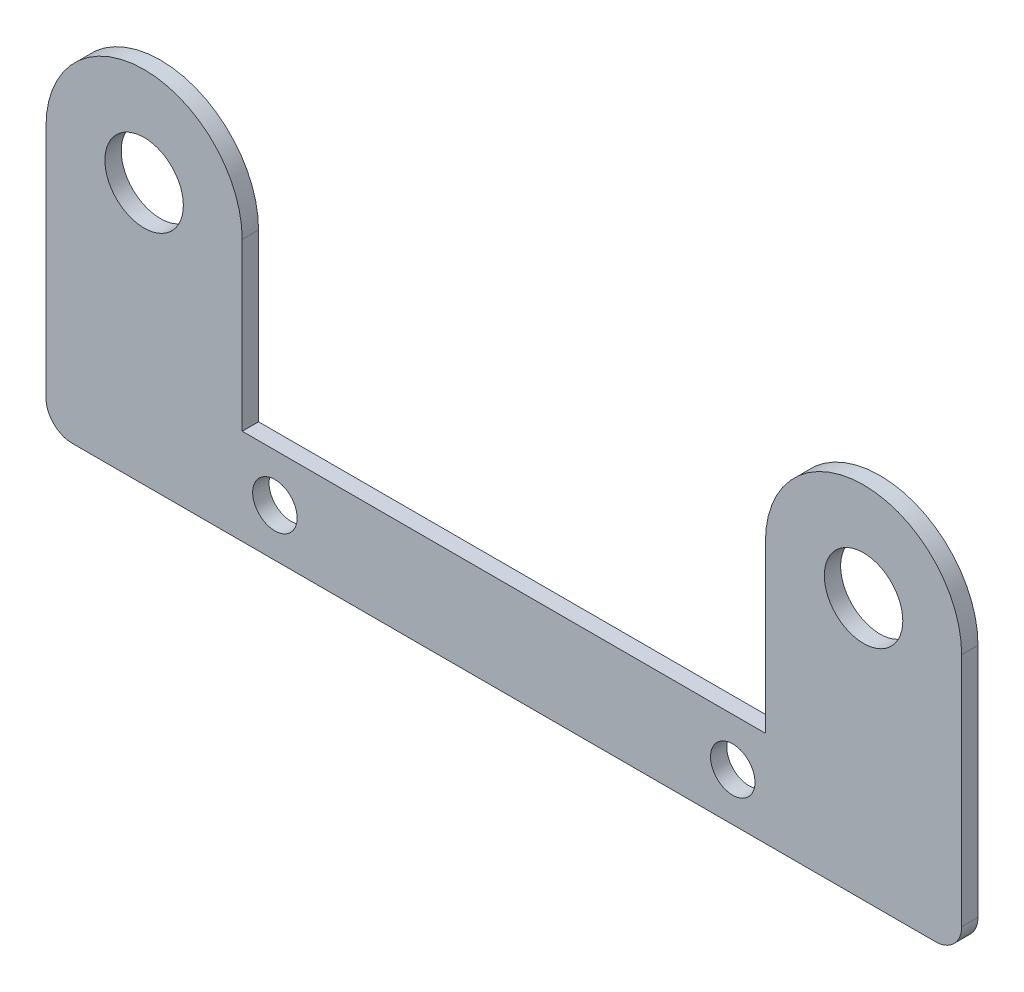
ISO-10303-21;
HEADER;
FILE_DESCRIPTION(('STEP AP214'),'2;1');
FILE_NAME('part.step','',(''),(''),'','','');
FILE_SCHEMA(('AUTOMOTIVE_DESIGN { 1 0 10303 214 1 1 1 1 }'));
ENDSEC;
DATA;
#1=APPLICATION_CONTEXT('core data for automotive mechanical design processes');
#2=APPLICATION_PROTOCOL_DEFINITION('international standard','automotive_design',2000,#1);
#3=PRODUCT_CONTEXT('',#1,'mechanical');
#4=PRODUCT('Part','Part','',(#3));
#5=PRODUCT_RELATED_PRODUCT_CATEGORY('part','',(#4));
#6=PRODUCT_DEFINITION_FORMATION('','',#4);
#7=PRODUCT_DEFINITION_CONTEXT('part definition',#1,'design');
#8=PRODUCT_DEFINITION('design','',#6,#7);
#9=PRODUCT_DEFINITION_SHAPE('','',#8);
#10=(LENGTH_UNIT() NAMED_UNIT(*) SI_UNIT(.MILLI.,.METRE.));
#11=(NAMED_UNIT(*) PLANE_ANGLE_UNIT() SI_UNIT($,.RADIAN.));
#12=(NAMED_UNIT(*) SI_UNIT($,.STERADIAN.) SOLID_ANGLE_UNIT());
#13=UNCERTAINTY_MEASURE_WITH_UNIT(LENGTH_MEASURE(1.E-05),#10,'distance_accuracy_value','');
#14=(GEOMETRIC_REPRESENTATION_CONTEXT(3) GLOBAL_UNCERTAINTY_ASSIGNED_CONTEXT((#13)) GLOBAL_UNIT_ASSIGNED_CONTEXT((#10,
#11,#12)) REPRESENTATION_CONTEXT('',''));
#15=CARTESIAN_POINT('',(0.,0.,0.));
#16=DIRECTION('',(0.,0.,1.));
#17=DIRECTION('',(1.,0.,0.));
#18=AXIS2_PLACEMENT_3D('',#15,#16,#17);
#19=CARTESIAN_POINT('',(9.525,25.4,1.5875));
#20=DIRECTION('',(0.,0.,-1.));
#21=DIRECTION('',(-1.,0.,0.));
#22=AXIS2_PLACEMENT_3D('',#19,#20,#21);
#23=PLANE('',#22);
#24=DIRECTION('',(1.,0.,0.));
#25=VECTOR('',#24,1.);
#26=CARTESIAN_POINT('',(0.,0.,1.5875));
#27=LINE('',#26,#25);
#28=CARTESIAN_POINT('',(2.54,0.,1.5875));
#29=VERTEX_POINT('',#28);
#30=CARTESIAN_POINT('',(86.36,0.,1.5875));
#31=VERTEX_POINT('',#30);
#32=EDGE_CURVE('E153',#29,#31,#27,.T.);
#33=ORIENTED_EDGE('',*,*,#32,.T.);
#34=CARTESIAN_POINT('',(86.36,2.54000000000002,1.5875));
#35=DIRECTION('',(0.,0.,-1.));
#36=DIRECTION('',(-1.,0.,0.));
#37=AXIS2_PLACEMENT_3D('',#34,#35,#36);
#38=CIRCLE('',#37,2.54);
#39=CARTESIAN_POINT('',(88.9,2.54000000000002,1.5875));
#40=VERTEX_POINT('',#39);
#41=EDGE_CURVE('E41',#31,#40,#38,.F.);
#42=ORIENTED_EDGE('',*,*,#41,.T.);
#43=DIRECTION('',(0.,1.,0.));
#44=VECTOR('',#43,1.);
#45=CARTESIAN_POINT('',(88.9,25.4,1.5875));
#46=LINE('',#45,#44);
#47=CARTESIAN_POINT('',(88.9,25.4,1.5875));
#48=VERTEX_POINT('',#47);
#49=EDGE_CURVE('E111',#40,#48,#46,.T.);
#50=ORIENTED_EDGE('',*,*,#49,.T.);
#51=CARTESIAN_POINT('',(79.375,25.4,1.5875));
#52=DIRECTION('',(0.,0.,1.));
#53=DIRECTION('',(-1.,0.,0.));
#54=AXIS2_PLACEMENT_3D('',#51,#52,#53);
#55=CIRCLE('',#54,9.525);
#56=CARTESIAN_POINT('',(69.85,25.4,1.5875));
#57=VERTEX_POINT('',#56);
#58=EDGE_CURVE('E114',#48,#57,#55,.T.);
#59=ORIENTED_EDGE('',*,*,#58,.T.);
#60=DIRECTION('',(0.,-1.,0.));
#61=VECTOR('',#60,1.);
#62=CARTESIAN_POINT('',(69.85,9.27100000000001,1.5875));
#63=LINE('',#62,#61);
#64=CARTESIAN_POINT('',(69.85,9.27100000000001,1.5875));
#65=VERTEX_POINT('',#64);
#66=EDGE_CURVE('E130',#57,#65,#63,.T.);
#67=ORIENTED_EDGE('',*,*,#66,.T.);
#68=DIRECTION('',(-1.,0.,0.));
#69=VECTOR('',#68,1.);
#70=CARTESIAN_POINT('',(19.05,9.271,1.5875));
#71=LINE('',#70,#69);
#72=CARTESIAN_POINT('',(19.05,9.271,1.5875));
#73=VERTEX_POINT('',#72);
#74=EDGE_CURVE('E191',#65,#73,#71,.T.);
#75=ORIENTED_EDGE('',*,*,#74,.T.);
#76=DIRECTION('',(0.,1.,0.));
#77=VECTOR('',#76,1.);
#78=CARTESIAN_POINT('',(19.05,25.4,1.5875));
#79=LINE('',#78,#77);
#80=CARTESIAN_POINT('',(19.05,25.4,1.5875));
#81=VERTEX_POINT('',#80);
#82=EDGE_CURVE('E206',#73,#81,#79,.T.);
#83=ORIENTED_EDGE('',*,*,#82,.T.);
#84=CARTESIAN_POINT('',(9.525,25.4,1.5875));
#85=DIRECTION('',(0.,0.,1.));
#86=DIRECTION('',(-1.,0.,0.));
#87=AXIS2_PLACEMENT_3D('',#84,#85,#86);
#88=CIRCLE('',#87,9.525);
#89=CARTESIAN_POINT('',(0.,25.4,1.5875));
#90=VERTEX_POINT('',#89);
#91=EDGE_CURVE('E204',#81,#90,#88,.T.);
#92=ORIENTED_EDGE('',*,*,#91,.T.);
#93=DIRECTION('',(0.,-1.,0.));
#94=VECTOR('',#93,1.);
#95=CARTESIAN_POINT('',(0.,25.4,1.5875));
#96=LINE('',#95,#94);
#97=CARTESIAN_POINT('',(0.,2.54,1.5875));
#98=VERTEX_POINT('',#97);
#99=EDGE_CURVE('E154',#90,#98,#96,.T.);
#100=ORIENTED_EDGE('',*,*,#99,.T.);
#101=CARTESIAN_POINT('',(2.54,2.54,1.5875));
#102=DIRECTION('',(0.,0.,-1.));
#103=DIRECTION('',(-1.,0.,0.));
#104=AXIS2_PLACEMENT_3D('',#101,#102,#103);
#105=CIRCLE('',#104,2.54);
#106=EDGE_CURVE('E151',#98,#29,#105,.F.);
#107=ORIENTED_EDGE('',*,*,#106,.T.);
#108=EDGE_LOOP('',(#33,#42,#50,#59,#67,#75,#83,#92,#100,#107));
#109=FACE_BOUND('',#108,.T.);
#110=CARTESIAN_POINT('',(22.225,4.63549999999998,1.5875));
#111=DIRECTION('',(0.,0.,1.));
#112=DIRECTION('',(1.,0.,0.));
#113=AXIS2_PLACEMENT_3D('',#110,#111,#112);
#114=CIRCLE('',#113,2.159);
#115=CARTESIAN_POINT('',(24.384,4.63549999999998,1.5875));
#116=VERTEX_POINT('',#115);
#117=EDGE_CURVE('E201',#116,#116,#114,.T.);
#118=ORIENTED_EDGE('',*,*,#117,.F.);
#119=EDGE_LOOP('',(#118));
#120=FACE_BOUND('',#119,.T.);
#121=CARTESIAN_POINT('',(66.675,4.63550000000002,1.5875));
#122=DIRECTION('',(0.,0.,1.));
#123=DIRECTION('',(1.,0.,0.));
#124=AXIS2_PLACEMENT_3D('',#121,#122,#123);
#125=CIRCLE('',#124,2.15899999999998);
#126=CARTESIAN_POINT('',(68.834,4.63550000000002,1.5875));
#127=VERTEX_POINT('',#126);
#128=EDGE_CURVE('E213',#127,#127,#125,.T.);
#129=ORIENTED_EDGE('',*,*,#128,.F.);
#130=EDGE_LOOP('',(#129));
#131=FACE_BOUND('',#130,.T.);
#132=CARTESIAN_POINT('',(9.525,25.4,1.5875));
#133=DIRECTION('',(0.,0.,1.));
#134=DIRECTION('',(1.,0.,0.));
#135=AXIS2_PLACEMENT_3D('',#132,#133,#134);
#136=CIRCLE('',#135,3.81);
#137=CARTESIAN_POINT('',(13.335,25.4,1.5875));
#138=VERTEX_POINT('',#137);
#139=EDGE_CURVE('E219',#138,#138,#136,.T.);
#140=ORIENTED_EDGE('',*,*,#139,.F.);
#141=EDGE_LOOP('',(#140));
#142=FACE_BOUND('',#141,.T.);
#143=CARTESIAN_POINT('',(79.375,25.4,1.5875));
#144=DIRECTION('',(0.,0.,1.));
#145=DIRECTION('',(1.,0.,0.));
#146=AXIS2_PLACEMENT_3D('',#143,#144,#145);
#147=CIRCLE('',#146,3.81);
#148=CARTESIAN_POINT('',(83.185,25.4,1.5875));
#149=VERTEX_POINT('',#148);
#150=EDGE_CURVE('E225',#149,#149,#147,.T.);
#151=ORIENTED_EDGE('',*,*,#150,.F.);
#152=EDGE_LOOP('',(#151));
#153=FACE_BOUND('',#152,.T.);
#154=ADVANCED_FACE('F33',(#109,#120,#131,#142,#153),#23,.F.);
#155=CARTESIAN_POINT('',(9.525,25.4,0.));
#156=DIRECTION('',(0.,0.,-1.));
#157=DIRECTION('',(-1.,0.,0.));
#158=AXIS2_PLACEMENT_3D('',#155,#156,#157);
#159=PLANE('',#158);
#160=CARTESIAN_POINT('',(9.525,25.4,0.));
#161=DIRECTION('',(0.,0.,1.));
#162=DIRECTION('',(1.,0.,0.));
#163=AXIS2_PLACEMENT_3D('',#160,#161,#162);
#164=CIRCLE('',#163,3.81);
#165=CARTESIAN_POINT('',(13.335,25.4,0.));
#166=VERTEX_POINT('',#165);
#167=EDGE_CURVE('E222',#166,#166,#164,.T.);
#168=ORIENTED_EDGE('',*,*,#167,.T.);
#169=EDGE_LOOP('',(#168));
#170=FACE_BOUND('',#169,.T.);
#171=CARTESIAN_POINT('',(22.225,4.63549999999998,0.));
#172=DIRECTION('',(0.,0.,1.));
#173=DIRECTION('',(1.,0.,0.));
#174=AXIS2_PLACEMENT_3D('',#171,#172,#173);
#175=CIRCLE('',#174,2.159);
#176=CARTESIAN_POINT('',(24.384,4.63549999999998,0.));
#177=VERTEX_POINT('',#176);
#178=EDGE_CURVE('E210',#177,#177,#175,.T.);
#179=ORIENTED_EDGE('',*,*,#178,.T.);
#180=EDGE_LOOP('',(#179));
#181=FACE_BOUND('',#180,.T.);
#182=DIRECTION('',(0.,1.,0.));
#183=VECTOR('',#182,1.);
#184=CARTESIAN_POINT('',(88.9,25.4,0.));
#185=LINE('',#184,#183);
#186=CARTESIAN_POINT('',(88.9,2.54000000000002,0.));
#187=VERTEX_POINT('',#186);
#188=CARTESIAN_POINT('',(88.9,25.4,0.));
#189=VERTEX_POINT('',#188);
#190=EDGE_CURVE('E134',#187,#189,#185,.T.);
#191=ORIENTED_EDGE('',*,*,#190,.F.);
#192=CARTESIAN_POINT('',(86.36,2.54000000000002,0.));
#193=DIRECTION('',(0.,0.,-1.));
#194=DIRECTION('',(-1.,0.,0.));
#195=AXIS2_PLACEMENT_3D('',#192,#193,#194);
#196=CIRCLE('',#195,2.54);
#197=CARTESIAN_POINT('',(86.36,0.,0.));
#198=VERTEX_POINT('',#197);
#199=EDGE_CURVE('E145',#187,#198,#196,.T.);
#200=ORIENTED_EDGE('',*,*,#199,.T.);
#201=DIRECTION('',(1.,0.,0.));
#202=VECTOR('',#201,1.);
#203=CARTESIAN_POINT('',(0.,0.,0.));
#204=LINE('',#203,#202);
#205=CARTESIAN_POINT('',(2.54,0.,0.));
#206=VERTEX_POINT('',#205);
#207=EDGE_CURVE('E121',#206,#198,#204,.T.);
#208=ORIENTED_EDGE('',*,*,#207,.F.);
#209=CARTESIAN_POINT('',(2.54,2.54,0.));
#210=DIRECTION('',(0.,0.,-1.));
#211=DIRECTION('',(-1.,0.,0.));
#212=AXIS2_PLACEMENT_3D('',#209,#210,#211);
#213=CIRCLE('',#212,2.54);
#214=CARTESIAN_POINT('',(0.,2.54,0.));
#215=VERTEX_POINT('',#214);
#216=EDGE_CURVE('E138',#206,#215,#213,.T.);
#217=ORIENTED_EDGE('',*,*,#216,.T.);
#218=DIRECTION('',(0.,-1.,0.));
#219=VECTOR('',#218,1.);
#220=CARTESIAN_POINT('',(0.,25.4,0.));
#221=LINE('',#220,#219);
#222=CARTESIAN_POINT('',(0.,25.4,0.));
#223=VERTEX_POINT('',#222);
#224=EDGE_CURVE('E166',#223,#215,#221,.T.);
#225=ORIENTED_EDGE('',*,*,#224,.F.);
#226=CARTESIAN_POINT('',(9.525,25.4,0.));
#227=DIRECTION('',(0.,0.,1.));
#228=DIRECTION('',(-1.,0.,0.));
#229=AXIS2_PLACEMENT_3D('',#226,#227,#228);
#230=CIRCLE('',#229,9.525);
#231=CARTESIAN_POINT('',(19.05,25.4,0.));
#232=VERTEX_POINT('',#231);
#233=EDGE_CURVE('E170',#232,#223,#230,.T.);
#234=ORIENTED_EDGE('',*,*,#233,.F.);
#235=DIRECTION('',(0.,1.,0.));
#236=VECTOR('',#235,1.);
#237=CARTESIAN_POINT('',(19.05,25.4,0.));
#238=LINE('',#237,#236);
#239=CARTESIAN_POINT('',(19.05,9.271,0.));
#240=VERTEX_POINT('',#239);
#241=EDGE_CURVE('E173',#240,#232,#238,.T.);
#242=ORIENTED_EDGE('',*,*,#241,.F.);
#243=DIRECTION('',(-1.,0.,0.));
#244=VECTOR('',#243,1.);
#245=CARTESIAN_POINT('',(19.05,9.271,0.));
#246=LINE('',#245,#244);
#247=CARTESIAN_POINT('',(69.85,9.27100000000001,0.));
#248=VERTEX_POINT('',#247);
#249=EDGE_CURVE('E190',#248,#240,#246,.T.);
#250=ORIENTED_EDGE('',*,*,#249,.F.);
#251=DIRECTION('',(0.,-1.,0.));
#252=VECTOR('',#251,1.);
#253=CARTESIAN_POINT('',(69.85,9.27100000000001,0.));
#254=LINE('',#253,#252);
#255=CARTESIAN_POINT('',(69.85,25.4,0.));
#256=VERTEX_POINT('',#255);
#257=EDGE_CURVE('E195',#256,#248,#254,.T.);
#258=ORIENTED_EDGE('',*,*,#257,.F.);
#259=CARTESIAN_POINT('',(79.375,25.4,0.));
#260=DIRECTION('',(0.,0.,1.));
#261=DIRECTION('',(-1.,0.,0.));
#262=AXIS2_PLACEMENT_3D('',#259,#260,#261);
#263=CIRCLE('',#262,9.525);
#264=EDGE_CURVE('E197',#189,#256,#263,.T.);
#265=ORIENTED_EDGE('',*,*,#264,.F.);
#266=EDGE_LOOP('',(#191,#200,#208,#217,#225,#234,#242,#250,#258,#265));
#267=FACE_BOUND('',#266,.T.);
#268=CARTESIAN_POINT('',(66.675,4.63550000000002,0.));
#269=DIRECTION('',(0.,0.,1.));
#270=DIRECTION('',(1.,0.,0.));
#271=AXIS2_PLACEMENT_3D('',#268,#269,#270);
#272=CIRCLE('',#271,2.15899999999998);
#273=CARTESIAN_POINT('',(68.834,4.63550000000002,0.));
#274=VERTEX_POINT('',#273);
#275=EDGE_CURVE('E216',#274,#274,#272,.T.);
#276=ORIENTED_EDGE('',*,*,#275,.T.);
#277=EDGE_LOOP('',(#276));
#278=FACE_BOUND('',#277,.T.);
#279=CARTESIAN_POINT('',(79.375,25.4,0.));
#280=DIRECTION('',(0.,0.,1.));
#281=DIRECTION('',(1.,0.,0.));
#282=AXIS2_PLACEMENT_3D('',#279,#280,#281);
#283=CIRCLE('',#282,3.81);
#284=CARTESIAN_POINT('',(83.185,25.4,0.));
#285=VERTEX_POINT('',#284);
#286=EDGE_CURVE('E228',#285,#285,#283,.T.);
#287=ORIENTED_EDGE('',*,*,#286,.T.);
#288=EDGE_LOOP('',(#287));
#289=FACE_BOUND('',#288,.T.);
#290=ADVANCED_FACE('F163',(#170,#181,#267,#278,#289),#159,.T.);
#291=CARTESIAN_POINT('',(88.9,25.4,1.5875));
#292=DIRECTION('',(-1.,0.,0.));
#293=DIRECTION('',(0.,-1.,0.));
#294=AXIS2_PLACEMENT_3D('',#291,#292,#293);
#295=PLANE('',#294);
#296=ORIENTED_EDGE('',*,*,#49,.F.);
#297=DIRECTION('',(0.,0.,-1.));
#298=VECTOR('',#297,1.);
#299=CARTESIAN_POINT('',(88.9,2.54000000000002,1.5875));
#300=LINE('',#299,#298);
#301=EDGE_CURVE('E136',#40,#187,#300,.T.);
#302=ORIENTED_EDGE('',*,*,#301,.T.);
#303=ORIENTED_EDGE('',*,*,#190,.T.);
#304=DIRECTION('',(0.,0.,-1.));
#305=VECTOR('',#304,1.);
#306=CARTESIAN_POINT('',(88.9,25.4,1.5875));
#307=LINE('',#306,#305);
#308=EDGE_CURVE('E126',#48,#189,#307,.T.);
#309=ORIENTED_EDGE('',*,*,#308,.F.);
#310=EDGE_LOOP('',(#296,#302,#303,#309));
#311=FACE_BOUND('',#310,.T.);
#312=ADVANCED_FACE('F132',(#311),#295,.F.);
#313=CARTESIAN_POINT('',(79.375,25.4,1.5875));
#314=DIRECTION('',(0.,0.,-1.));
#315=DIRECTION('',(-1.,0.,0.));
#316=AXIS2_PLACEMENT_3D('',#313,#314,#315);
#317=CYLINDRICAL_SURFACE('',#316,9.525);
#318=ORIENTED_EDGE('',*,*,#264,.T.);
#319=DIRECTION('',(0.,0.,-1.));
#320=VECTOR('',#319,1.);
#321=CARTESIAN_POINT('',(69.85,25.4,1.5875));
#322=LINE('',#321,#320);
#323=EDGE_CURVE('E128',#57,#256,#322,.T.);
#324=ORIENTED_EDGE('',*,*,#323,.F.);
#325=ORIENTED_EDGE('',*,*,#58,.F.);
#326=ORIENTED_EDGE('',*,*,#308,.T.);
#327=EDGE_LOOP('',(#318,#324,#325,#326));
#328=FACE_BOUND('',#327,.T.);
#329=ADVANCED_FACE('F125',(#328),#317,.T.);
#330=CARTESIAN_POINT('',(69.85,9.27100000000001,1.5875));
#331=DIRECTION('',(1.,0.,0.));
#332=DIRECTION('',(0.,1.,0.));
#333=AXIS2_PLACEMENT_3D('',#330,#331,#332);
#334=PLANE('',#333);
#335=ORIENTED_EDGE('',*,*,#257,.T.);
#336=DIRECTION('',(0.,0.,-1.));
#337=VECTOR('',#336,1.);
#338=CARTESIAN_POINT('',(69.85,9.27100000000001,1.5875));
#339=LINE('',#338,#337);
#340=EDGE_CURVE('E140',#65,#248,#339,.T.);
#341=ORIENTED_EDGE('',*,*,#340,.F.);
#342=ORIENTED_EDGE('',*,*,#66,.F.);
#343=ORIENTED_EDGE('',*,*,#323,.T.);
#344=EDGE_LOOP('',(#335,#341,#342,#343));
#345=FACE_BOUND('',#344,.T.);
#346=ADVANCED_FACE('F262',(#345),#334,.F.);
#347=CARTESIAN_POINT('',(19.05,9.271,1.5875));
#348=DIRECTION('',(0.,-1.,0.));
#349=DIRECTION('',(1.,0.,0.));
#350=AXIS2_PLACEMENT_3D('',#347,#348,#349);
#351=PLANE('',#350);
#352=ORIENTED_EDGE('',*,*,#249,.T.);
#353=DIRECTION('',(0.,0.,-1.));
#354=VECTOR('',#353,1.);
#355=CARTESIAN_POINT('',(19.05,9.271,1.5875));
#356=LINE('',#355,#354);
#357=EDGE_CURVE('E181',#73,#240,#356,.T.);
#358=ORIENTED_EDGE('',*,*,#357,.F.);
#359=ORIENTED_EDGE('',*,*,#74,.F.);
#360=ORIENTED_EDGE('',*,*,#340,.T.);
#361=EDGE_LOOP('',(#352,#358,#359,#360));
#362=FACE_BOUND('',#361,.T.);
#363=ADVANCED_FACE('F188',(#362),#351,.F.);
#364=CARTESIAN_POINT('',(19.05,25.4,1.5875));
#365=DIRECTION('',(-1.,0.,0.));
#366=DIRECTION('',(0.,-1.,0.));
#367=AXIS2_PLACEMENT_3D('',#364,#365,#366);
#368=PLANE('',#367);
#369=ORIENTED_EDGE('',*,*,#241,.T.);
#370=DIRECTION('',(0.,0.,-1.));
#371=VECTOR('',#370,1.);
#372=CARTESIAN_POINT('',(19.05,25.4,1.5875));
#373=LINE('',#372,#371);
#374=EDGE_CURVE('E178',#81,#232,#373,.T.);
#375=ORIENTED_EDGE('',*,*,#374,.F.);
#376=ORIENTED_EDGE('',*,*,#82,.F.);
#377=ORIENTED_EDGE('',*,*,#357,.T.);
#378=EDGE_LOOP('',(#369,#375,#376,#377));
#379=FACE_BOUND('',#378,.T.);
#380=ADVANCED_FACE('F255',(#379),#368,.F.);
#381=CARTESIAN_POINT('',(9.525,25.4,1.5875));
#382=DIRECTION('',(0.,0.,-1.));
#383=DIRECTION('',(-1.,0.,0.));
#384=AXIS2_PLACEMENT_3D('',#381,#382,#383);
#385=CYLINDRICAL_SURFACE('',#384,9.525);
#386=ORIENTED_EDGE('',*,*,#233,.T.);
#387=DIRECTION('',(0.,0.,-1.));
#388=VECTOR('',#387,1.);
#389=CARTESIAN_POINT('',(0.,25.4,1.5875));
#390=LINE('',#389,#388);
#391=EDGE_CURVE('E159',#90,#223,#390,.T.);
#392=ORIENTED_EDGE('',*,*,#391,.F.);
#393=ORIENTED_EDGE('',*,*,#91,.F.);
#394=ORIENTED_EDGE('',*,*,#374,.T.);
#395=EDGE_LOOP('',(#386,#392,#393,#394));
#396=FACE_BOUND('',#395,.T.);
#397=ADVANCED_FACE('F252',(#396),#385,.T.);
#398=CARTESIAN_POINT('',(0.,25.4,1.5875));
#399=DIRECTION('',(1.,0.,0.));
#400=DIRECTION('',(0.,1.,0.));
#401=AXIS2_PLACEMENT_3D('',#398,#399,#400);
#402=PLANE('',#401);
#403=ORIENTED_EDGE('',*,*,#224,.T.);
#404=DIRECTION('',(0.,0.,-1.));
#405=VECTOR('',#404,1.);
#406=CARTESIAN_POINT('',(0.,2.54,1.5875));
#407=LINE('',#406,#405);
#408=EDGE_CURVE('E11',#215,#98,#407,.F.);
#409=ORIENTED_EDGE('',*,*,#408,.T.);
#410=ORIENTED_EDGE('',*,*,#99,.F.);
#411=ORIENTED_EDGE('',*,*,#391,.T.);
#412=EDGE_LOOP('',(#403,#409,#410,#411));
#413=FACE_BOUND('',#412,.T.);
#414=ADVANCED_FACE('F168',(#413),#402,.F.);
#415=CARTESIAN_POINT('',(0.,0.,1.5875));
#416=DIRECTION('',(0.,1.,0.));
#417=DIRECTION('',(-1.,0.,0.));
#418=AXIS2_PLACEMENT_3D('',#415,#416,#417);
#419=PLANE('',#418);
#420=ORIENTED_EDGE('',*,*,#207,.T.);
#421=DIRECTION('',(0.,0.,-1.));
#422=VECTOR('',#421,1.);
#423=CARTESIAN_POINT('',(86.36,0.,1.5875));
#424=LINE('',#423,#422);
#425=EDGE_CURVE('E54',#198,#31,#424,.F.);
#426=ORIENTED_EDGE('',*,*,#425,.T.);
#427=ORIENTED_EDGE('',*,*,#32,.F.);
#428=DIRECTION('',(0.,0.,-1.));
#429=VECTOR('',#428,1.);
#430=CARTESIAN_POINT('',(2.54,0.,1.5875));
#431=LINE('',#430,#429);
#432=EDGE_CURVE('E147',#29,#206,#431,.T.);
#433=ORIENTED_EDGE('',*,*,#432,.T.);
#434=EDGE_LOOP('',(#420,#426,#427,#433));
#435=FACE_BOUND('',#434,.T.);
#436=ADVANCED_FACE('F157',(#435),#419,.F.);
#437=CARTESIAN_POINT('',(22.225,4.63549999999998,1.5875));
#438=DIRECTION('',(0.,0.,-1.));
#439=DIRECTION('',(-1.,0.,0.));
#440=AXIS2_PLACEMENT_3D('',#437,#438,#439);
#441=CYLINDRICAL_SURFACE('',#440,2.159);
#442=ORIENTED_EDGE('',*,*,#117,.T.);
#443=EDGE_LOOP('',(#442));
#444=FACE_BOUND('',#443,.T.);
#445=ORIENTED_EDGE('',*,*,#178,.F.);
#446=EDGE_LOOP('',(#445));
#447=FACE_BOUND('',#446,.T.);
#448=ADVANCED_FACE('F245',(#444,#447),#441,.F.);
#449=CARTESIAN_POINT('',(66.675,4.63550000000002,1.5875));
#450=DIRECTION('',(0.,0.,-1.));
#451=DIRECTION('',(-1.,0.,0.));
#452=AXIS2_PLACEMENT_3D('',#449,#450,#451);
#453=CYLINDRICAL_SURFACE('',#452,2.15899999999998);
#454=ORIENTED_EDGE('',*,*,#128,.T.);
#455=EDGE_LOOP('',(#454));
#456=FACE_BOUND('',#455,.T.);
#457=ORIENTED_EDGE('',*,*,#275,.F.);
#458=EDGE_LOOP('',(#457));
#459=FACE_BOUND('',#458,.T.);
#460=ADVANCED_FACE('F283',(#456,#459),#453,.F.);
#461=CARTESIAN_POINT('',(9.525,25.4,1.5875));
#462=DIRECTION('',(0.,0.,-1.));
#463=DIRECTION('',(-1.,0.,0.));
#464=AXIS2_PLACEMENT_3D('',#461,#462,#463);
#465=CYLINDRICAL_SURFACE('',#464,3.81);
#466=ORIENTED_EDGE('',*,*,#139,.T.);
#467=EDGE_LOOP('',(#466));
#468=FACE_BOUND('',#467,.T.);
#469=ORIENTED_EDGE('',*,*,#167,.F.);
#470=EDGE_LOOP('',(#469));
#471=FACE_BOUND('',#470,.T.);
#472=ADVANCED_FACE('F275',(#468,#471),#465,.F.);
#473=CARTESIAN_POINT('',(79.375,25.4,1.5875));
#474=DIRECTION('',(0.,0.,-1.));
#475=DIRECTION('',(-1.,0.,0.));
#476=AXIS2_PLACEMENT_3D('',#473,#474,#475);
#477=CYLINDRICAL_SURFACE('',#476,3.81);
#478=ORIENTED_EDGE('',*,*,#150,.T.);
#479=EDGE_LOOP('',(#478));
#480=FACE_BOUND('',#479,.T.);
#481=ORIENTED_EDGE('',*,*,#286,.F.);
#482=EDGE_LOOP('',(#481));
#483=FACE_BOUND('',#482,.T.);
#484=ADVANCED_FACE('F234',(#480,#483),#477,.F.);
#485=CARTESIAN_POINT('',(86.36,2.54000000000002,1.5875));
#486=DIRECTION('',(0.,0.,-1.));
#487=DIRECTION('',(-1.,0.,0.));
#488=AXIS2_PLACEMENT_3D('',#485,#486,#487);
#489=CYLINDRICAL_SURFACE('',#488,2.54);
#490=ORIENTED_EDGE('',*,*,#41,.F.);
#491=ORIENTED_EDGE('',*,*,#425,.F.);
#492=ORIENTED_EDGE('',*,*,#199,.F.);
#493=ORIENTED_EDGE('',*,*,#301,.F.);
#494=EDGE_LOOP('',(#490,#491,#492,#493));
#495=FACE_BOUND('',#494,.T.);
#496=ADVANCED_FACE('F268',(#495),#489,.T.);
#497=CARTESIAN_POINT('',(2.54,2.54,1.5875));
#498=DIRECTION('',(0.,0.,-1.));
#499=DIRECTION('',(-1.,0.,0.));
#500=AXIS2_PLACEMENT_3D('',#497,#498,#499);
#501=CYLINDRICAL_SURFACE('',#500,2.54);
#502=ORIENTED_EDGE('',*,*,#106,.F.);
#503=ORIENTED_EDGE('',*,*,#408,.F.);
#504=ORIENTED_EDGE('',*,*,#216,.F.);
#505=ORIENTED_EDGE('',*,*,#432,.F.);
#506=EDGE_LOOP('',(#502,#503,#504,#505));
#507=FACE_BOUND('',#506,.T.);
#508=ADVANCED_FACE('F35',(#507),#501,.T.);
#509=CLOSED_SHELL('',(#154,#290,#312,#329,#346,#363,#380,#397,#414,#436,#448,#460,#472,#484,
#496,#508));
#510=MANIFOLD_SOLID_BREP('B2',#509);
#511=ADVANCED_BREP_SHAPE_REPRESENTATION('',(#18,#510),#14);
#512=SHAPE_DEFINITION_REPRESENTATION(#9,#511);
ENDSEC;
END-ISO-10303-21;
